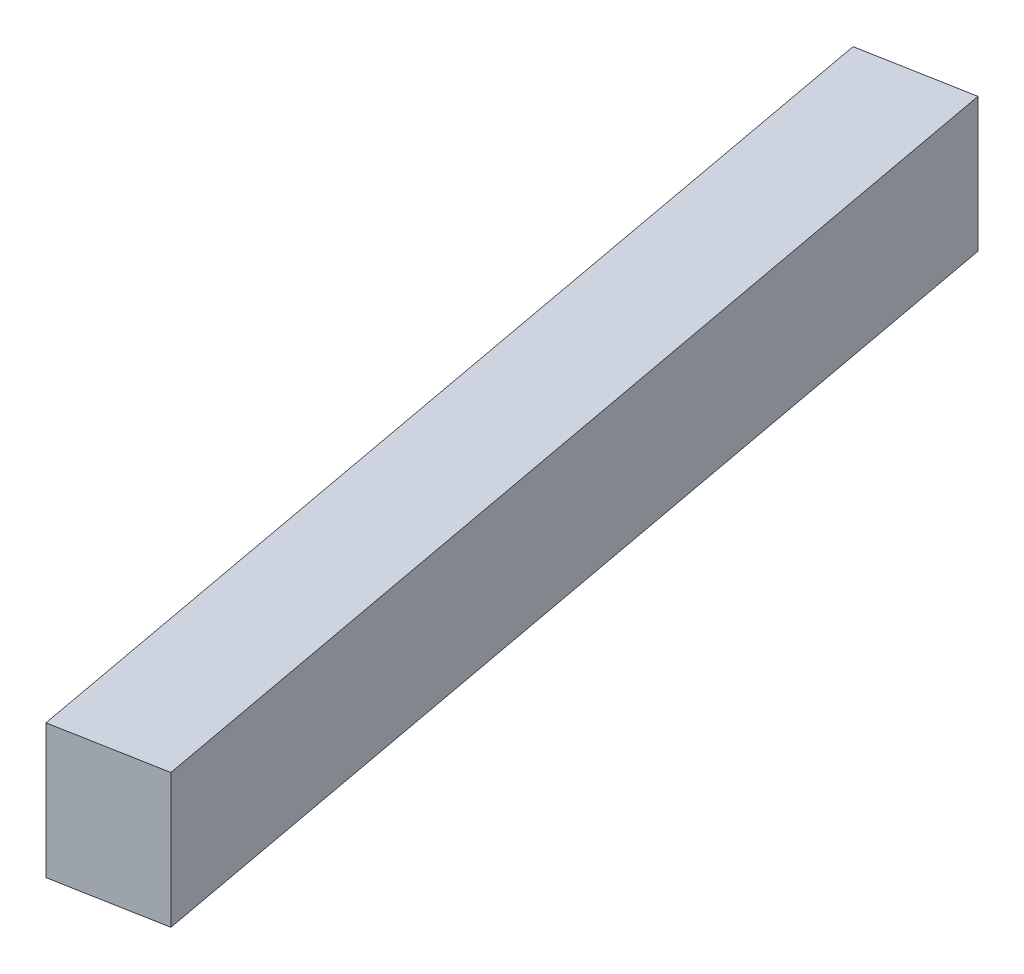
ISO-10303-21;
HEADER;
FILE_DESCRIPTION(('STEP AP214'),'2;1');
FILE_NAME('part.step','',(''),(''),'','','');
FILE_SCHEMA(('AUTOMOTIVE_DESIGN { 1 0 10303 214 1 1 1 1 }'));
ENDSEC;
DATA;
#1=APPLICATION_CONTEXT('core data for automotive mechanical design processes');
#2=APPLICATION_PROTOCOL_DEFINITION('international standard','automotive_design',2000,#1);
#3=PRODUCT_CONTEXT('',#1,'mechanical');
#4=PRODUCT('Part','Part','',(#3));
#5=PRODUCT_RELATED_PRODUCT_CATEGORY('part','',(#4));
#6=PRODUCT_DEFINITION_FORMATION('','',#4);
#7=PRODUCT_DEFINITION_CONTEXT('part definition',#1,'design');
#8=PRODUCT_DEFINITION('design','',#6,#7);
#9=PRODUCT_DEFINITION_SHAPE('','',#8);
#10=(LENGTH_UNIT() NAMED_UNIT(*) SI_UNIT(.MILLI.,.METRE.));
#11=(NAMED_UNIT(*) PLANE_ANGLE_UNIT() SI_UNIT($,.RADIAN.));
#12=(NAMED_UNIT(*) SI_UNIT($,.STERADIAN.) SOLID_ANGLE_UNIT());
#13=UNCERTAINTY_MEASURE_WITH_UNIT(LENGTH_MEASURE(1.E-05),#10,'distance_accuracy_value','');
#14=(GEOMETRIC_REPRESENTATION_CONTEXT(3) GLOBAL_UNCERTAINTY_ASSIGNED_CONTEXT((#13)) GLOBAL_UNIT_ASSIGNED_CONTEXT((#10,
#11,#12)) REPRESENTATION_CONTEXT('',''));
#15=CARTESIAN_POINT('',(0.,0.,0.));
#16=DIRECTION('',(0.,0.,1.));
#17=DIRECTION('',(1.,0.,0.));
#18=AXIS2_PLACEMENT_3D('',#15,#16,#17);
#19=CARTESIAN_POINT('',(3.35732375513111,7.874,17.6821078035752));
#20=DIRECTION('',(-0.983483135071587,0.,0.180999787374912));
#21=DIRECTION('',(0.180999787374912,0.,0.983483135071587));
#22=AXIS2_PLACEMENT_3D('',#19,#20,#21);
#23=PLANE('',#22);
#24=DIRECTION('',(0.,1.,0.));
#25=VECTOR('',#24,1.);
#26=CARTESIAN_POINT('',(3.35732375513111,7.874,17.6821078035752));
#27=LINE('',#26,#25);
#28=CARTESIAN_POINT('',(3.35732375513111,7.62,17.6821078035752));
#29=VERTEX_POINT('',#28);
#30=CARTESIAN_POINT('',(3.35732375513111,7.874,17.6821078035752));
#31=VERTEX_POINT('',#30);
#32=EDGE_CURVE('E20',#29,#31,#27,.T.);
#33=ORIENTED_EDGE('',*,*,#32,.T.);
#34=DIRECTION('',(-0.18099978737492,0.,-0.983483135071585));
#35=VECTOR('',#34,1.);
#36=CARTESIAN_POINT('',(3.70212835008032,7.874,19.5556431758865));
#37=LINE('',#36,#35);
#38=CARTESIAN_POINT('',(3.70212835008032,7.874,19.5556431758865));
#39=VERTEX_POINT('',#38);
#40=EDGE_CURVE('E55',#39,#31,#37,.T.);
#41=ORIENTED_EDGE('',*,*,#40,.F.);
#42=DIRECTION('',(0.,1.,0.));
#43=VECTOR('',#42,1.);
#44=CARTESIAN_POINT('',(3.70212835008032,7.874,19.5556431758865));
#45=LINE('',#44,#43);
#46=CARTESIAN_POINT('',(3.70212835008032,7.62,19.5556431758865));
#47=VERTEX_POINT('',#46);
#48=EDGE_CURVE('E76',#39,#47,#45,.F.);
#49=ORIENTED_EDGE('',*,*,#48,.T.);
#50=DIRECTION('',(-0.18099978737492,0.,-0.983483135071585));
#51=VECTOR('',#50,1.);
#52=CARTESIAN_POINT('',(3.70212835008032,7.62,19.5556431758865));
#53=LINE('',#52,#51);
#54=EDGE_CURVE('E58',#47,#29,#53,.T.);
#55=ORIENTED_EDGE('',*,*,#54,.T.);
#56=EDGE_LOOP('',(#33,#41,#49,#55));
#57=FACE_BOUND('',#56,.T.);
#58=ADVANCED_FACE('F17',(#57),#23,.F.);
#59=CARTESIAN_POINT('',(3.35732375513111,7.874,17.6821078035752));
#60=DIRECTION('',(0.180999787374922,0.,0.983483135071585));
#61=DIRECTION('',(0.983483135071585,0.,-0.180999787374922));
#62=AXIS2_PLACEMENT_3D('',#59,#60,#61);
#63=PLANE('',#62);
#64=DIRECTION('',(0.,1.,0.));
#65=VECTOR('',#64,1.);
#66=CARTESIAN_POINT('',(3.15747998208456,7.874,17.7188869603697));
#67=LINE('',#66,#65);
#68=CARTESIAN_POINT('',(3.15747998208457,7.62,17.7188869603697));
#69=VERTEX_POINT('',#68);
#70=CARTESIAN_POINT('',(3.15747998208457,7.874,17.7188869603697));
#71=VERTEX_POINT('',#70);
#72=EDGE_CURVE('E73',#69,#71,#67,.T.);
#73=ORIENTED_EDGE('',*,*,#72,.T.);
#74=DIRECTION('',(-0.983483135071658,0.,0.180999787374526));
#75=VECTOR('',#74,1.);
#76=CARTESIAN_POINT('',(3.35732375513111,7.874,17.6821078035752));
#77=LINE('',#76,#75);
#78=EDGE_CURVE('E63',#31,#71,#77,.T.);
#79=ORIENTED_EDGE('',*,*,#78,.F.);
#80=ORIENTED_EDGE('',*,*,#32,.F.);
#81=DIRECTION('',(-0.983483135071658,0.,0.180999787374526));
#82=VECTOR('',#81,1.);
#83=CARTESIAN_POINT('',(3.35732375513111,7.62,17.6821078035752));
#84=LINE('',#83,#82);
#85=EDGE_CURVE('E80',#29,#69,#84,.T.);
#86=ORIENTED_EDGE('',*,*,#85,.T.);
#87=EDGE_LOOP('',(#73,#79,#80,#86));
#88=FACE_BOUND('',#87,.T.);
#89=ADVANCED_FACE('F72',(#88),#63,.F.);
#90=CARTESIAN_POINT('',(3.15747998208456,7.874,17.7188869603697));
#91=DIRECTION('',(0.,1.,0.));
#92=DIRECTION('',(0.,0.,1.));
#93=AXIS2_PLACEMENT_3D('',#90,#91,#92);
#94=PLANE('',#93);
#95=DIRECTION('',(-0.983483134796046,0.,0.180999788872095));
#96=VECTOR('',#95,1.);
#97=CARTESIAN_POINT('',(3.70212835008032,7.874,19.5556431758865));
#98=LINE('',#97,#96);
#99=CARTESIAN_POINT('',(3.50228457708976,7.874,19.5924223329853));
#100=VERTEX_POINT('',#99);
#101=EDGE_CURVE('E69',#100,#39,#98,.F.);
#102=ORIENTED_EDGE('',*,*,#101,.T.);
#103=ORIENTED_EDGE('',*,*,#40,.T.);
#104=ORIENTED_EDGE('',*,*,#78,.T.);
#105=DIRECTION('',(-0.180999787374912,0.,-0.983483135071587));
#106=VECTOR('',#105,1.);
#107=CARTESIAN_POINT('',(3.15747998208456,7.874,17.7188869603697));
#108=LINE('',#107,#106);
#109=EDGE_CURVE('E83',#71,#100,#108,.F.);
#110=ORIENTED_EDGE('',*,*,#109,.T.);
#111=EDGE_LOOP('',(#102,#103,#104,#110));
#112=FACE_BOUND('',#111,.T.);
#113=ADVANCED_FACE('F66',(#112),#94,.T.);
#114=CARTESIAN_POINT('',(3.70212835008032,7.874,19.5556431758865));
#115=DIRECTION('',(-0.180999788872095,0.,-0.983483134796046));
#116=DIRECTION('',(-0.983483134796046,0.,0.180999788872095));
#117=AXIS2_PLACEMENT_3D('',#114,#115,#116);
#118=PLANE('',#117);
#119=ORIENTED_EDGE('',*,*,#48,.F.);
#120=ORIENTED_EDGE('',*,*,#101,.F.);
#121=DIRECTION('',(0.,1.,0.));
#122=VECTOR('',#121,1.);
#123=CARTESIAN_POINT('',(3.50228457708976,7.874,19.5924223329853));
#124=LINE('',#123,#122);
#125=CARTESIAN_POINT('',(3.50228457708976,7.62,19.5924223329853));
#126=VERTEX_POINT('',#125);
#127=EDGE_CURVE('E26',#100,#126,#124,.F.);
#128=ORIENTED_EDGE('',*,*,#127,.T.);
#129=DIRECTION('',(0.983483134796055,0.,-0.180999788872045));
#130=VECTOR('',#129,1.);
#131=CARTESIAN_POINT('',(3.50228457708976,7.62,19.5924223329853));
#132=LINE('',#131,#130);
#133=EDGE_CURVE('E34',#126,#47,#132,.T.);
#134=ORIENTED_EDGE('',*,*,#133,.T.);
#135=EDGE_LOOP('',(#119,#120,#128,#134));
#136=FACE_BOUND('',#135,.T.);
#137=ADVANCED_FACE('F88',(#136),#118,.F.);
#138=CARTESIAN_POINT('',(3.15747998208456,7.62,17.7188869603697));
#139=DIRECTION('',(0.,1.,0.));
#140=DIRECTION('',(0.,0.,1.));
#141=AXIS2_PLACEMENT_3D('',#138,#139,#140);
#142=PLANE('',#141);
#143=ORIENTED_EDGE('',*,*,#54,.F.);
#144=ORIENTED_EDGE('',*,*,#133,.F.);
#145=DIRECTION('',(-0.180999787374912,0.,-0.983483135071587));
#146=VECTOR('',#145,1.);
#147=CARTESIAN_POINT('',(3.15747998208456,7.62,17.7188869603697));
#148=LINE('',#147,#146);
#149=EDGE_CURVE('E11',#126,#69,#148,.T.);
#150=ORIENTED_EDGE('',*,*,#149,.T.);
#151=ORIENTED_EDGE('',*,*,#85,.F.);
#152=EDGE_LOOP('',(#143,#144,#150,#151));
#153=FACE_BOUND('',#152,.T.);
#154=ADVANCED_FACE('F91',(#153),#142,.F.);
#155=CARTESIAN_POINT('',(3.15747998208456,7.874,17.7188869603697));
#156=DIRECTION('',(0.983483135071587,0.,-0.180999787374912));
#157=DIRECTION('',(-0.180999787374912,0.,-0.983483135071587));
#158=AXIS2_PLACEMENT_3D('',#155,#156,#157);
#159=PLANE('',#158);
#160=ORIENTED_EDGE('',*,*,#127,.F.);
#161=ORIENTED_EDGE('',*,*,#109,.F.);
#162=ORIENTED_EDGE('',*,*,#72,.F.);
#163=ORIENTED_EDGE('',*,*,#149,.F.);
#164=EDGE_LOOP('',(#160,#161,#162,#163));
#165=FACE_BOUND('',#164,.T.);
#166=ADVANCED_FACE('F90',(#165),#159,.F.);
#167=CLOSED_SHELL('',(#58,#89,#113,#137,#154,#166));
#168=MANIFOLD_SOLID_BREP('B1',#167);
#169=ADVANCED_BREP_SHAPE_REPRESENTATION('',(#18,#168),#14);
#170=SHAPE_DEFINITION_REPRESENTATION(#9,#169);
ENDSEC;
END-ISO-10303-21;
